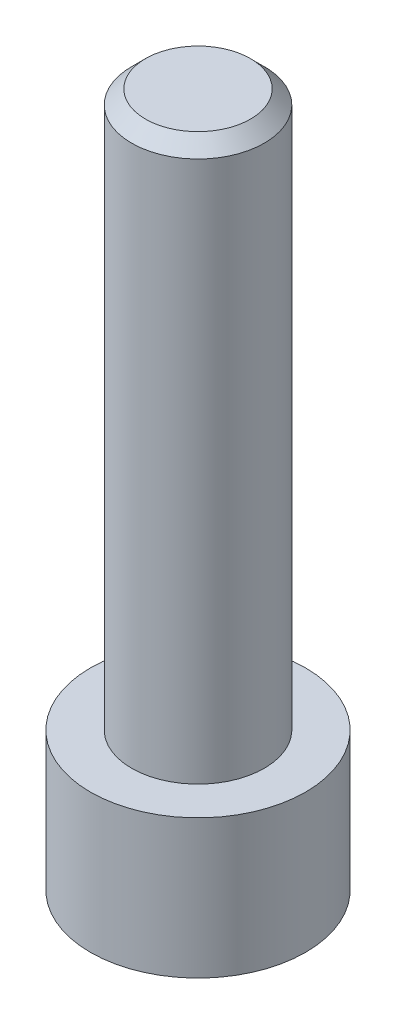
ISO-10303-21;
HEADER;
FILE_DESCRIPTION(('STEP AP214'),'2;1');
FILE_NAME('part.step','',(''),(''),'','','');
FILE_SCHEMA(('AUTOMOTIVE_DESIGN { 1 0 10303 214 1 1 1 1 }'));
ENDSEC;
DATA;
#1=APPLICATION_CONTEXT('core data for automotive mechanical design processes');
#2=APPLICATION_PROTOCOL_DEFINITION('international standard','automotive_design',2000,#1);
#3=PRODUCT_CONTEXT('',#1,'mechanical');
#4=PRODUCT('Part','Part','',(#3));
#5=PRODUCT_RELATED_PRODUCT_CATEGORY('part','',(#4));
#6=PRODUCT_DEFINITION_FORMATION('','',#4);
#7=PRODUCT_DEFINITION_CONTEXT('part definition',#1,'design');
#8=PRODUCT_DEFINITION('design','',#6,#7);
#9=PRODUCT_DEFINITION_SHAPE('','',#8);
#10=(LENGTH_UNIT() NAMED_UNIT(*) SI_UNIT(.MILLI.,.METRE.));
#11=(NAMED_UNIT(*) PLANE_ANGLE_UNIT() SI_UNIT($,.RADIAN.));
#12=(NAMED_UNIT(*) SI_UNIT($,.STERADIAN.) SOLID_ANGLE_UNIT());
#13=UNCERTAINTY_MEASURE_WITH_UNIT(LENGTH_MEASURE(1.E-05),#10,'distance_accuracy_value','');
#14=(GEOMETRIC_REPRESENTATION_CONTEXT(3) GLOBAL_UNCERTAINTY_ASSIGNED_CONTEXT((#13)) GLOBAL_UNIT_ASSIGNED_CONTEXT((#10,
#11,#12)) REPRESENTATION_CONTEXT('',''));
#15=CARTESIAN_POINT('',(0.,0.,0.));
#16=DIRECTION('',(0.,0.,1.));
#17=DIRECTION('',(1.,0.,0.));
#18=AXIS2_PLACEMENT_3D('',#15,#16,#17);
#19=CARTESIAN_POINT('',(0.,25.,0.));
#20=DIRECTION('',(0.,-1.,0.));
#21=DIRECTION('',(0.,0.,-1.));
#22=AXIS2_PLACEMENT_3D('',#19,#20,#21);
#23=CYLINDRICAL_SURFACE('',#22,3.875);
#24=CARTESIAN_POINT('',(0.,0.,0.));
#25=DIRECTION('',(0.,1.,0.));
#26=DIRECTION('',(0.,0.,1.));
#27=AXIS2_PLACEMENT_3D('',#24,#25,#26);
#28=CIRCLE('',#27,3.875);
#29=CARTESIAN_POINT('',(0.,0.,3.875));
#30=VERTEX_POINT('',#29);
#31=EDGE_CURVE('E145',#30,#30,#28,.T.);
#32=ORIENTED_EDGE('',*,*,#31,.T.);
#33=EDGE_LOOP('',(#32));
#34=FACE_BOUND('',#33,.T.);
#35=CARTESIAN_POINT('',(0.,5.,0.));
#36=DIRECTION('',(0.,1.,0.));
#37=DIRECTION('',(0.,0.,1.));
#38=AXIS2_PLACEMENT_3D('',#35,#36,#37);
#39=CIRCLE('',#38,3.875);
#40=CARTESIAN_POINT('',(0.,5.,3.875));
#41=VERTEX_POINT('',#40);
#42=EDGE_CURVE('E144',#41,#41,#39,.T.);
#43=ORIENTED_EDGE('',*,*,#42,.F.);
#44=EDGE_LOOP('',(#43));
#45=FACE_BOUND('',#44,.T.);
#46=ADVANCED_FACE('F34',(#34,#45),#23,.T.);
#47=CARTESIAN_POINT('',(0.,0.,0.));
#48=DIRECTION('',(0.,1.,0.));
#49=DIRECTION('',(0.,0.,1.));
#50=AXIS2_PLACEMENT_3D('',#47,#48,#49);
#51=PLANE('',#50);
#52=DIRECTION('',(-0.5,0.,0.866025403784439));
#53=VECTOR('',#52,1.);
#54=CARTESIAN_POINT('',(2.64426423288849,0.,0.));
#55=LINE('',#54,#53);
#56=CARTESIAN_POINT('',(2.64426423288849,0.,0.));
#57=VERTEX_POINT('',#56);
#58=CARTESIAN_POINT('',(1.32213211644424,0.,2.29));
#59=VERTEX_POINT('',#58);
#60=EDGE_CURVE('E123',#57,#59,#55,.T.);
#61=ORIENTED_EDGE('',*,*,#60,.F.);
#62=DIRECTION('',(0.5,0.,0.866025403784439));
#63=VECTOR('',#62,1.);
#64=CARTESIAN_POINT('',(1.32213211644424,0.,-2.29));
#65=LINE('',#64,#63);
#66=CARTESIAN_POINT('',(1.32213211644424,0.,-2.29));
#67=VERTEX_POINT('',#66);
#68=EDGE_CURVE('E49',#67,#57,#65,.T.);
#69=ORIENTED_EDGE('',*,*,#68,.F.);
#70=DIRECTION('',(1.,0.,0.));
#71=VECTOR('',#70,1.);
#72=CARTESIAN_POINT('',(-1.32213211644424,0.,-2.29));
#73=LINE('',#72,#71);
#74=CARTESIAN_POINT('',(-1.32213211644424,0.,-2.29));
#75=VERTEX_POINT('',#74);
#76=EDGE_CURVE('E132',#75,#67,#73,.T.);
#77=ORIENTED_EDGE('',*,*,#76,.F.);
#78=DIRECTION('',(0.5,0.,-0.866025403784439));
#79=VECTOR('',#78,1.);
#80=CARTESIAN_POINT('',(-2.64426423288849,0.,0.));
#81=LINE('',#80,#79);
#82=CARTESIAN_POINT('',(-2.64426423288849,0.,0.));
#83=VERTEX_POINT('',#82);
#84=EDGE_CURVE('E130',#83,#75,#81,.T.);
#85=ORIENTED_EDGE('',*,*,#84,.F.);
#86=DIRECTION('',(-0.5,0.,-0.866025403784439));
#87=VECTOR('',#86,1.);
#88=CARTESIAN_POINT('',(-1.32213211644424,0.,2.29));
#89=LINE('',#88,#87);
#90=CARTESIAN_POINT('',(-1.32213211644424,0.,2.29));
#91=VERTEX_POINT('',#90);
#92=EDGE_CURVE('E97',#91,#83,#89,.T.);
#93=ORIENTED_EDGE('',*,*,#92,.F.);
#94=DIRECTION('',(-1.,0.,0.));
#95=VECTOR('',#94,1.);
#96=CARTESIAN_POINT('',(1.32213211644424,0.,2.29));
#97=LINE('',#96,#95);
#98=EDGE_CURVE('E126',#59,#91,#97,.T.);
#99=ORIENTED_EDGE('',*,*,#98,.F.);
#100=EDGE_LOOP('',(#61,#69,#77,#85,#93,#99));
#101=FACE_BOUND('',#100,.T.);
#102=ORIENTED_EDGE('',*,*,#31,.F.);
#103=EDGE_LOOP('',(#102));
#104=FACE_BOUND('',#103,.T.);
#105=ADVANCED_FACE('F167',(#101,#104),#51,.F.);
#106=CARTESIAN_POINT('',(0.,5.,0.));
#107=DIRECTION('',(0.,1.,0.));
#108=DIRECTION('',(0.,0.,1.));
#109=AXIS2_PLACEMENT_3D('',#106,#107,#108);
#110=PLANE('',#109);
#111=CARTESIAN_POINT('',(0.,5.,0.));
#112=DIRECTION('',(0.,1.,0.));
#113=DIRECTION('',(0.,0.,1.));
#114=AXIS2_PLACEMENT_3D('',#111,#112,#113);
#115=CIRCLE('',#114,2.39);
#116=CARTESIAN_POINT('',(0.,5.,2.39));
#117=VERTEX_POINT('',#116);
#118=EDGE_CURVE('E136',#117,#117,#115,.T.);
#119=ORIENTED_EDGE('',*,*,#118,.F.);
#120=EDGE_LOOP('',(#119));
#121=FACE_BOUND('',#120,.T.);
#122=ORIENTED_EDGE('',*,*,#42,.T.);
#123=EDGE_LOOP('',(#122));
#124=FACE_BOUND('',#123,.T.);
#125=ADVANCED_FACE('F172',(#121,#124),#110,.T.);
#126=CARTESIAN_POINT('',(0.,5.,0.));
#127=DIRECTION('',(0.,1.,0.));
#128=DIRECTION('',(0.,0.,1.));
#129=AXIS2_PLACEMENT_3D('',#126,#127,#128);
#130=CYLINDRICAL_SURFACE('',#129,2.39);
#131=CARTESIAN_POINT('',(0.,24.5,0.));
#132=DIRECTION('',(0.,1.,0.));
#133=DIRECTION('',(0.,0.,1.));
#134=AXIS2_PLACEMENT_3D('',#131,#132,#133);
#135=CIRCLE('',#134,2.39);
#136=CARTESIAN_POINT('',(0.,24.5,2.39));
#137=VERTEX_POINT('',#136);
#138=EDGE_CURVE('E12',#137,#137,#135,.F.);
#139=ORIENTED_EDGE('',*,*,#138,.T.);
#140=EDGE_LOOP('',(#139));
#141=FACE_BOUND('',#140,.T.);
#142=ORIENTED_EDGE('',*,*,#118,.T.);
#143=EDGE_LOOP('',(#142));
#144=FACE_BOUND('',#143,.T.);
#145=ADVANCED_FACE('F163',(#141,#144),#130,.T.);
#146=CARTESIAN_POINT('',(0.,25.,0.));
#147=DIRECTION('',(0.,1.,0.));
#148=DIRECTION('',(0.,0.,1.));
#149=AXIS2_PLACEMENT_3D('',#146,#147,#148);
#150=PLANE('',#149);
#151=CARTESIAN_POINT('',(0.,25.,0.));
#152=DIRECTION('',(0.,1.,0.));
#153=DIRECTION('',(0.,0.,1.));
#154=AXIS2_PLACEMENT_3D('',#151,#152,#153);
#155=CIRCLE('',#154,1.89);
#156=CARTESIAN_POINT('',(0.,25.,1.89));
#157=VERTEX_POINT('',#156);
#158=EDGE_CURVE('E42',#157,#157,#155,.T.);
#159=ORIENTED_EDGE('',*,*,#158,.T.);
#160=EDGE_LOOP('',(#159));
#161=FACE_BOUND('',#160,.T.);
#162=ADVANCED_FACE('F152',(#161),#150,.T.);
#163=CARTESIAN_POINT('',(0.,25.,0.));
#164=DIRECTION('',(0.,-1.,0.));
#165=DIRECTION('',(0.,0.,-1.));
#166=AXIS2_PLACEMENT_3D('',#163,#164,#165);
#167=CONICAL_SURFACE('',#166,1.89,0.785398163397449);
#168=ORIENTED_EDGE('',*,*,#138,.F.);
#169=EDGE_LOOP('',(#168));
#170=FACE_BOUND('',#169,.T.);
#171=ORIENTED_EDGE('',*,*,#158,.F.);
#172=EDGE_LOOP('',(#171));
#173=FACE_BOUND('',#172,.T.);
#174=ADVANCED_FACE('F36',(#170,#173),#167,.T.);
#175=CARTESIAN_POINT('',(1.32213211644424,3.36,-2.29));
#176=DIRECTION('',(0.866025403784439,0.,-0.5));
#177=DIRECTION('',(-0.5,0.,-0.866025403784439));
#178=AXIS2_PLACEMENT_3D('',#175,#176,#177);
#179=PLANE('',#178);
#180=ORIENTED_EDGE('',*,*,#68,.T.);
#181=DIRECTION('',(0.,-1.,0.));
#182=VECTOR('',#181,1.);
#183=CARTESIAN_POINT('',(2.64426423288849,3.36,0.));
#184=LINE('',#183,#182);
#185=CARTESIAN_POINT('',(2.64426423288849,3.36,0.));
#186=VERTEX_POINT('',#185);
#187=EDGE_CURVE('E79',#186,#57,#184,.T.);
#188=ORIENTED_EDGE('',*,*,#187,.F.);
#189=DIRECTION('',(0.5,0.,0.866025403784439));
#190=VECTOR('',#189,1.);
#191=CARTESIAN_POINT('',(1.32213211644424,3.36,-2.29));
#192=LINE('',#191,#190);
#193=CARTESIAN_POINT('',(1.32213211644424,3.36,-2.29));
#194=VERTEX_POINT('',#193);
#195=EDGE_CURVE('E134',#194,#186,#192,.T.);
#196=ORIENTED_EDGE('',*,*,#195,.F.);
#197=DIRECTION('',(0.,-1.,0.));
#198=VECTOR('',#197,1.);
#199=CARTESIAN_POINT('',(1.32213211644424,3.36,-2.29));
#200=LINE('',#199,#198);
#201=EDGE_CURVE('E57',#194,#67,#200,.T.);
#202=ORIENTED_EDGE('',*,*,#201,.T.);
#203=EDGE_LOOP('',(#180,#188,#196,#202));
#204=FACE_BOUND('',#203,.T.);
#205=ADVANCED_FACE('F155',(#204),#179,.F.);
#206=CARTESIAN_POINT('',(-1.32213211644424,3.36,-2.29));
#207=DIRECTION('',(0.,0.,-1.));
#208=DIRECTION('',(-1.,0.,0.));
#209=AXIS2_PLACEMENT_3D('',#206,#207,#208);
#210=PLANE('',#209);
#211=ORIENTED_EDGE('',*,*,#76,.T.);
#212=ORIENTED_EDGE('',*,*,#201,.F.);
#213=DIRECTION('',(1.,0.,0.));
#214=VECTOR('',#213,1.);
#215=CARTESIAN_POINT('',(-1.32213211644424,3.36,-2.29));
#216=LINE('',#215,#214);
#217=CARTESIAN_POINT('',(-1.32213211644424,3.36,-2.29));
#218=VERTEX_POINT('',#217);
#219=EDGE_CURVE('E109',#218,#194,#216,.T.);
#220=ORIENTED_EDGE('',*,*,#219,.F.);
#221=DIRECTION('',(0.,-1.,0.));
#222=VECTOR('',#221,1.);
#223=CARTESIAN_POINT('',(-1.32213211644424,3.36,-2.29));
#224=LINE('',#223,#222);
#225=EDGE_CURVE('E101',#218,#75,#224,.T.);
#226=ORIENTED_EDGE('',*,*,#225,.T.);
#227=EDGE_LOOP('',(#211,#212,#220,#226));
#228=FACE_BOUND('',#227,.T.);
#229=ADVANCED_FACE('F161',(#228),#210,.F.);
#230=CARTESIAN_POINT('',(-2.64426423288849,3.36,0.));
#231=DIRECTION('',(-0.866025403784438,0.,-0.5));
#232=DIRECTION('',(-0.5,0.,0.866025403784439));
#233=AXIS2_PLACEMENT_3D('',#230,#231,#232);
#234=PLANE('',#233);
#235=ORIENTED_EDGE('',*,*,#84,.T.);
#236=ORIENTED_EDGE('',*,*,#225,.F.);
#237=DIRECTION('',(0.5,0.,-0.866025403784439));
#238=VECTOR('',#237,1.);
#239=CARTESIAN_POINT('',(-2.64426423288849,3.36,0.));
#240=LINE('',#239,#238);
#241=CARTESIAN_POINT('',(-2.64426423288849,3.36,0.));
#242=VERTEX_POINT('',#241);
#243=EDGE_CURVE('E105',#242,#218,#240,.T.);
#244=ORIENTED_EDGE('',*,*,#243,.F.);
#245=DIRECTION('',(0.,-1.,0.));
#246=VECTOR('',#245,1.);
#247=CARTESIAN_POINT('',(-2.64426423288849,3.36,0.));
#248=LINE('',#247,#246);
#249=EDGE_CURVE('E90',#242,#83,#248,.T.);
#250=ORIENTED_EDGE('',*,*,#249,.T.);
#251=EDGE_LOOP('',(#235,#236,#244,#250));
#252=FACE_BOUND('',#251,.T.);
#253=ADVANCED_FACE('F106',(#252),#234,.F.);
#254=CARTESIAN_POINT('',(-1.32213211644424,3.36,2.29));
#255=DIRECTION('',(-0.866025403784439,0.,0.5));
#256=DIRECTION('',(0.5,0.,0.866025403784439));
#257=AXIS2_PLACEMENT_3D('',#254,#255,#256);
#258=PLANE('',#257);
#259=ORIENTED_EDGE('',*,*,#92,.T.);
#260=ORIENTED_EDGE('',*,*,#249,.F.);
#261=DIRECTION('',(-0.5,0.,-0.866025403784439));
#262=VECTOR('',#261,1.);
#263=CARTESIAN_POINT('',(-1.32213211644424,3.36,2.29));
#264=LINE('',#263,#262);
#265=CARTESIAN_POINT('',(-1.32213211644424,3.36,2.29));
#266=VERTEX_POINT('',#265);
#267=EDGE_CURVE('E94',#266,#242,#264,.T.);
#268=ORIENTED_EDGE('',*,*,#267,.F.);
#269=DIRECTION('',(0.,-1.,0.));
#270=VECTOR('',#269,1.);
#271=CARTESIAN_POINT('',(-1.32213211644424,3.36,2.29));
#272=LINE('',#271,#270);
#273=EDGE_CURVE('E102',#266,#91,#272,.T.);
#274=ORIENTED_EDGE('',*,*,#273,.T.);
#275=EDGE_LOOP('',(#259,#260,#268,#274));
#276=FACE_BOUND('',#275,.T.);
#277=ADVANCED_FACE('F92',(#276),#258,.F.);
#278=CARTESIAN_POINT('',(1.32213211644424,3.36,2.29));
#279=DIRECTION('',(0.,0.,1.));
#280=DIRECTION('',(1.,0.,0.));
#281=AXIS2_PLACEMENT_3D('',#278,#279,#280);
#282=PLANE('',#281);
#283=ORIENTED_EDGE('',*,*,#98,.T.);
#284=ORIENTED_EDGE('',*,*,#273,.F.);
#285=DIRECTION('',(-1.,0.,0.));
#286=VECTOR('',#285,1.);
#287=CARTESIAN_POINT('',(1.32213211644424,3.36,2.29));
#288=LINE('',#287,#286);
#289=CARTESIAN_POINT('',(1.32213211644424,3.36,2.29));
#290=VERTEX_POINT('',#289);
#291=EDGE_CURVE('E115',#290,#266,#288,.T.);
#292=ORIENTED_EDGE('',*,*,#291,.F.);
#293=DIRECTION('',(0.,-1.,0.));
#294=VECTOR('',#293,1.);
#295=CARTESIAN_POINT('',(1.32213211644424,3.36,2.29));
#296=LINE('',#295,#294);
#297=EDGE_CURVE('E139',#290,#59,#296,.T.);
#298=ORIENTED_EDGE('',*,*,#297,.T.);
#299=EDGE_LOOP('',(#283,#284,#292,#298));
#300=FACE_BOUND('',#299,.T.);
#301=ADVANCED_FACE('F186',(#300),#282,.F.);
#302=CARTESIAN_POINT('',(2.64426423288849,3.36,0.));
#303=DIRECTION('',(0.866025403784439,0.,0.5));
#304=DIRECTION('',(0.5,0.,-0.866025403784439));
#305=AXIS2_PLACEMENT_3D('',#302,#303,#304);
#306=PLANE('',#305);
#307=ORIENTED_EDGE('',*,*,#60,.T.);
#308=ORIENTED_EDGE('',*,*,#297,.F.);
#309=DIRECTION('',(-0.5,0.,0.866025403784439));
#310=VECTOR('',#309,1.);
#311=CARTESIAN_POINT('',(2.64426423288849,3.36,0.));
#312=LINE('',#311,#310);
#313=EDGE_CURVE('E117',#186,#290,#312,.T.);
#314=ORIENTED_EDGE('',*,*,#313,.F.);
#315=ORIENTED_EDGE('',*,*,#187,.T.);
#316=EDGE_LOOP('',(#307,#308,#314,#315));
#317=FACE_BOUND('',#316,.T.);
#318=ADVANCED_FACE('F183',(#317),#306,.F.);
#319=CARTESIAN_POINT('',(0.,3.36,0.));
#320=DIRECTION('',(0.,-1.,0.));
#321=DIRECTION('',(0.,0.,-1.));
#322=AXIS2_PLACEMENT_3D('',#319,#320,#321);
#323=PLANE('',#322);
#324=ORIENTED_EDGE('',*,*,#195,.T.);
#325=ORIENTED_EDGE('',*,*,#313,.T.);
#326=ORIENTED_EDGE('',*,*,#291,.T.);
#327=ORIENTED_EDGE('',*,*,#267,.T.);
#328=ORIENTED_EDGE('',*,*,#243,.T.);
#329=ORIENTED_EDGE('',*,*,#219,.T.);
#330=EDGE_LOOP('',(#324,#325,#326,#327,#328,#329));
#331=FACE_BOUND('',#330,.T.);
#332=ADVANCED_FACE('F112',(#331),#323,.T.);
#333=CLOSED_SHELL('',(#46,#105,#125,#145,#162,#174,#205,#229,#253,#277,#301,#318,#332));
#334=MANIFOLD_SOLID_BREP('B2',#333);
#335=ADVANCED_BREP_SHAPE_REPRESENTATION('',(#18,#334),#14);
#336=SHAPE_DEFINITION_REPRESENTATION(#9,#335);
ENDSEC;
END-ISO-10303-21;
